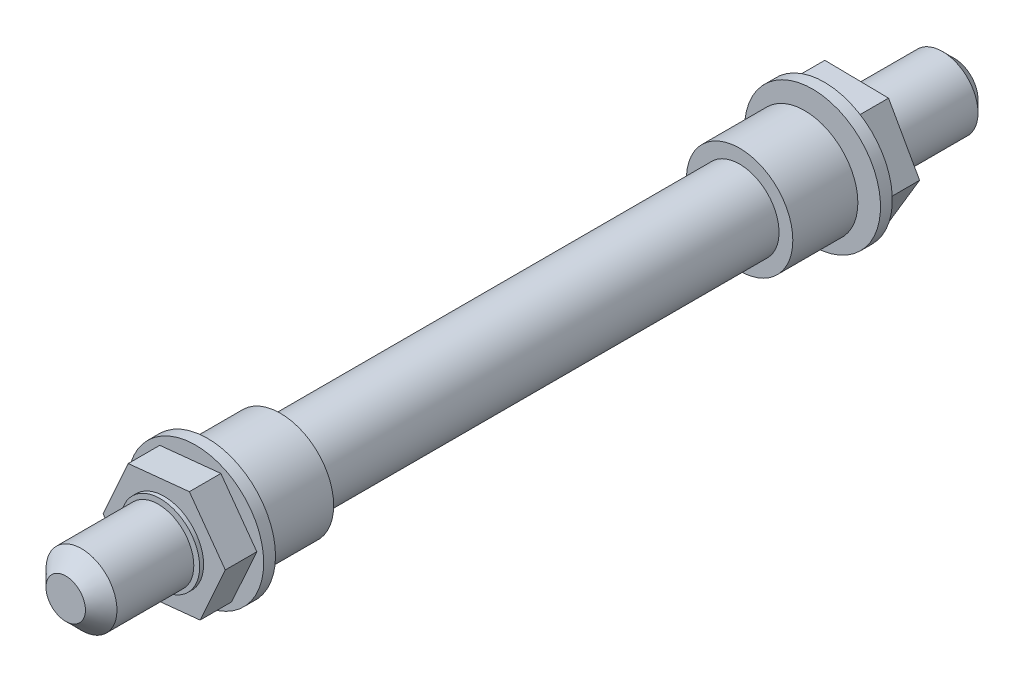
ISO-10303-21;
HEADER;
FILE_DESCRIPTION(('STEP AP214'),'2;1');
FILE_NAME('part.step','',(''),(''),'','','');
FILE_SCHEMA(('AUTOMOTIVE_DESIGN { 1 0 10303 214 1 1 1 1 }'));
ENDSEC;
DATA;
#1=APPLICATION_CONTEXT('core data for automotive mechanical design processes');
#2=APPLICATION_PROTOCOL_DEFINITION('international standard','automotive_design',2000,#1);
#3=PRODUCT_CONTEXT('',#1,'mechanical');
#4=PRODUCT('Part','Part','',(#3));
#5=PRODUCT_RELATED_PRODUCT_CATEGORY('part','',(#4));
#6=PRODUCT_DEFINITION_FORMATION('','',#4);
#7=PRODUCT_DEFINITION_CONTEXT('part definition',#1,'design');
#8=PRODUCT_DEFINITION('design','',#6,#7);
#9=PRODUCT_DEFINITION_SHAPE('','',#8);
#10=(LENGTH_UNIT() NAMED_UNIT(*) SI_UNIT(.MILLI.,.METRE.));
#11=(NAMED_UNIT(*) PLANE_ANGLE_UNIT() SI_UNIT($,.RADIAN.));
#12=(NAMED_UNIT(*) SI_UNIT($,.STERADIAN.) SOLID_ANGLE_UNIT());
#13=UNCERTAINTY_MEASURE_WITH_UNIT(LENGTH_MEASURE(1.E-05),#10,'distance_accuracy_value','');
#14=(GEOMETRIC_REPRESENTATION_CONTEXT(3) GLOBAL_UNCERTAINTY_ASSIGNED_CONTEXT((#13)) GLOBAL_UNIT_ASSIGNED_CONTEXT((#10,
#11,#12)) REPRESENTATION_CONTEXT('',''));
#15=CARTESIAN_POINT('',(0.,0.,0.));
#16=DIRECTION('',(0.,0.,1.));
#17=DIRECTION('',(1.,0.,0.));
#18=AXIS2_PLACEMENT_3D('',#15,#16,#17);
#19=CARTESIAN_POINT('',(0.,0.,-79.75));
#20=DIRECTION('',(0.,0.,-1.));
#21=DIRECTION('',(-1.,0.,0.));
#22=AXIS2_PLACEMENT_3D('',#19,#20,#21);
#23=PLANE('',#22);
#24=CARTESIAN_POINT('',(0.,0.,-79.75));
#25=DIRECTION('',(0.,0.,-1.));
#26=DIRECTION('',(-1.,0.,0.));
#27=AXIS2_PLACEMENT_3D('',#24,#25,#26);
#28=CIRCLE('',#27,17.25);
#29=CARTESIAN_POINT('',(-17.25,0.,-79.75));
#30=VERTEX_POINT('',#29);
#31=EDGE_CURVE('E194',#30,#30,#28,.T.);
#32=ORIENTED_EDGE('',*,*,#31,.T.);
#33=EDGE_LOOP('',(#32));
#34=FACE_BOUND('',#33,.T.);
#35=DIRECTION('',(0.999894472103177,-0.0145273761398714,0.));
#36=VECTOR('',#35,1.);
#37=CARTESIAN_POINT('',(-7.87866753086163,14.1159459927941,-79.75));
#38=LINE('',#37,#36);
#39=CARTESIAN_POINT('',(-7.87866753086163,14.1159459927941,-79.75));
#40=VERTEX_POINT('',#39);
#41=CARTESIAN_POINT('',(8.28543406277803,13.8810992260948,-79.75));
#42=VERTEX_POINT('',#41);
#43=EDGE_CURVE('E326',#40,#42,#38,.T.);
#44=ORIENTED_EDGE('',*,*,#43,.F.);
#45=DIRECTION('',(0.512528312839049,0.858670325875046,0.));
#46=VECTOR('',#45,1.);
#47=CARTESIAN_POINT('',(-16.1641015936397,0.234846766699263,-79.75));
#48=LINE('',#47,#46);
#49=CARTESIAN_POINT('',(-16.1641015936397,0.234846766699263,-79.75));
#50=VERTEX_POINT('',#49);
#51=EDGE_CURVE('E305',#50,#40,#48,.T.);
#52=ORIENTED_EDGE('',*,*,#51,.F.);
#53=DIRECTION('',(-0.487366159264128,0.873197702014918,0.));
#54=VECTOR('',#53,1.);
#55=CARTESIAN_POINT('',(-8.28543406277803,-13.8810992260948,-79.75));
#56=LINE('',#55,#54);
#57=CARTESIAN_POINT('',(-8.28543406277803,-13.8810992260948,-79.75));
#58=VERTEX_POINT('',#57);
#59=EDGE_CURVE('E301',#58,#50,#56,.T.);
#60=ORIENTED_EDGE('',*,*,#59,.F.);
#61=DIRECTION('',(-0.999894472103177,0.0145273761398714,0.));
#62=VECTOR('',#61,1.);
#63=CARTESIAN_POINT('',(7.87866753086163,-14.1159459927941,-79.75));
#64=LINE('',#63,#62);
#65=CARTESIAN_POINT('',(7.87866753086163,-14.1159459927941,-79.75));
#66=VERTEX_POINT('',#65);
#67=EDGE_CURVE('E320',#66,#58,#64,.T.);
#68=ORIENTED_EDGE('',*,*,#67,.F.);
#69=DIRECTION('',(-0.512528312839049,-0.858670325875046,0.));
#70=VECTOR('',#69,1.);
#71=CARTESIAN_POINT('',(16.1641015936397,-0.234846766699264,-79.75));
#72=LINE('',#71,#70);
#73=CARTESIAN_POINT('',(16.1641015936397,-0.234846766699264,-79.75));
#74=VERTEX_POINT('',#73);
#75=EDGE_CURVE('E322',#74,#66,#72,.T.);
#76=ORIENTED_EDGE('',*,*,#75,.F.);
#77=DIRECTION('',(0.487366159264128,-0.873197702014918,0.));
#78=VECTOR('',#77,1.);
#79=CARTESIAN_POINT('',(8.28543406277803,13.8810992260948,-79.75));
#80=LINE('',#79,#78);
#81=EDGE_CURVE('E324',#42,#74,#80,.T.);
#82=ORIENTED_EDGE('',*,*,#81,.F.);
#83=EDGE_LOOP('',(#44,#52,#60,#68,#76,#82));
#84=FACE_BOUND('',#83,.T.);
#85=ADVANCED_FACE('F34',(#34,#84),#23,.T.);
#86=CARTESIAN_POINT('',(0.,0.,-88.75));
#87=DIRECTION('',(0.,0.,1.));
#88=DIRECTION('',(1.,0.,0.));
#89=AXIS2_PLACEMENT_3D('',#86,#87,#88);
#90=CYLINDRICAL_SURFACE('',#89,10.);
#91=CARTESIAN_POINT('',(0.,0.,-74.75));
#92=DIRECTION('',(0.,0.,-1.));
#93=DIRECTION('',(-1.,0.,0.));
#94=AXIS2_PLACEMENT_3D('',#91,#92,#93);
#95=CIRCLE('',#94,10.);
#96=CARTESIAN_POINT('',(-10.,0.,-74.75));
#97=VERTEX_POINT('',#96);
#98=EDGE_CURVE('E179',#97,#97,#95,.T.);
#99=ORIENTED_EDGE('',*,*,#98,.T.);
#100=EDGE_LOOP('',(#99));
#101=FACE_BOUND('',#100,.T.);
#102=CARTESIAN_POINT('',(0.,0.,-76.75));
#103=DIRECTION('',(0.,0.,-1.));
#104=DIRECTION('',(-1.,0.,0.));
#105=AXIS2_PLACEMENT_3D('',#102,#103,#104);
#106=CIRCLE('',#105,10.);
#107=CARTESIAN_POINT('',(-10.,0.,-76.75));
#108=VERTEX_POINT('',#107);
#109=EDGE_CURVE('E191',#108,#108,#106,.F.);
#110=ORIENTED_EDGE('',*,*,#109,.T.);
#111=EDGE_LOOP('',(#110));
#112=FACE_BOUND('',#111,.T.);
#113=ADVANCED_FACE('F349',(#101,#112),#90,.T.);
#114=CARTESIAN_POINT('',(0.,0.,88.75));
#115=DIRECTION('',(0.,0.,1.));
#116=DIRECTION('',(1.,0.,0.));
#117=AXIS2_PLACEMENT_3D('',#114,#115,#116);
#118=PLANE('',#117);
#119=CARTESIAN_POINT('',(0.,0.,88.75));
#120=DIRECTION('',(0.,0.,1.));
#121=DIRECTION('',(1.,0.,0.));
#122=AXIS2_PLACEMENT_3D('',#119,#120,#121);
#123=CIRCLE('',#122,10.);
#124=CARTESIAN_POINT('',(10.,0.,88.75));
#125=VERTEX_POINT('',#124);
#126=EDGE_CURVE('E156',#125,#125,#123,.T.);
#127=ORIENTED_EDGE('',*,*,#126,.T.);
#128=EDGE_LOOP('',(#127));
#129=FACE_BOUND('',#128,.T.);
#130=CARTESIAN_POINT('',(0.,0.,88.75));
#131=DIRECTION('',(0.,0.,1.));
#132=DIRECTION('',(1.,0.,0.));
#133=AXIS2_PLACEMENT_3D('',#130,#131,#132);
#134=CIRCLE('',#133,3.);
#135=CARTESIAN_POINT('',(3.,0.,88.75));
#136=VERTEX_POINT('',#135);
#137=EDGE_CURVE('E149',#136,#136,#134,.T.);
#138=ORIENTED_EDGE('',*,*,#137,.F.);
#139=EDGE_LOOP('',(#138));
#140=FACE_BOUND('',#139,.T.);
#141=ADVANCED_FACE('F354',(#129,#140),#118,.T.);
#142=CARTESIAN_POINT('',(0.,0.,88.75));
#143=DIRECTION('',(0.,0.,-1.));
#144=DIRECTION('',(-1.,0.,0.));
#145=AXIS2_PLACEMENT_3D('',#142,#143,#144);
#146=CYLINDRICAL_SURFACE('',#145,10.);
#147=CARTESIAN_POINT('',(0.,0.,87.75));
#148=DIRECTION('',(0.,0.,1.));
#149=DIRECTION('',(1.,0.,0.));
#150=AXIS2_PLACEMENT_3D('',#147,#148,#149);
#151=CIRCLE('',#150,10.);
#152=CARTESIAN_POINT('',(10.,0.,87.75));
#153=VERTEX_POINT('',#152);
#154=EDGE_CURVE('E145',#153,#153,#151,.T.);
#155=ORIENTED_EDGE('',*,*,#154,.T.);
#156=EDGE_LOOP('',(#155));
#157=FACE_BOUND('',#156,.T.);
#158=ORIENTED_EDGE('',*,*,#126,.F.);
#159=EDGE_LOOP('',(#158));
#160=FACE_BOUND('',#159,.T.);
#161=ADVANCED_FACE('F459',(#157,#160),#146,.T.);
#162=CARTESIAN_POINT('',(0.,0.,89.23));
#163=DIRECTION('',(0.,0.,-1.));
#164=DIRECTION('',(-1.,0.,0.));
#165=AXIS2_PLACEMENT_3D('',#162,#163,#164);
#166=CYLINDRICAL_SURFACE('',#165,3.);
#167=CARTESIAN_POINT('',(0.,0.,89.23));
#168=DIRECTION('',(0.,0.,1.));
#169=DIRECTION('',(1.,0.,0.));
#170=AXIS2_PLACEMENT_3D('',#167,#168,#169);
#171=CIRCLE('',#170,3.);
#172=CARTESIAN_POINT('',(3.,0.,89.23));
#173=VERTEX_POINT('',#172);
#174=EDGE_CURVE('E150',#173,#173,#171,.T.);
#175=ORIENTED_EDGE('',*,*,#174,.F.);
#176=EDGE_LOOP('',(#175));
#177=FACE_BOUND('',#176,.T.);
#178=ORIENTED_EDGE('',*,*,#137,.T.);
#179=EDGE_LOOP('',(#178));
#180=FACE_BOUND('',#179,.T.);
#181=ADVANCED_FACE('F452',(#177,#180),#166,.T.);
#182=CARTESIAN_POINT('',(0.,0.,89.23));
#183=DIRECTION('',(0.,0.,1.));
#184=DIRECTION('',(1.,0.,0.));
#185=AXIS2_PLACEMENT_3D('',#182,#183,#184);
#186=PLANE('',#185);
#187=CARTESIAN_POINT('',(0.,0.,89.23));
#188=DIRECTION('',(0.,0.,1.));
#189=DIRECTION('',(1.,0.,0.));
#190=AXIS2_PLACEMENT_3D('',#187,#188,#189);
#191=CIRCLE('',#190,9.);
#192=CARTESIAN_POINT('',(9.,0.,89.23));
#193=VERTEX_POINT('',#192);
#194=EDGE_CURVE('E146',#193,#193,#191,.T.);
#195=ORIENTED_EDGE('',*,*,#194,.F.);
#196=EDGE_LOOP('',(#195));
#197=FACE_BOUND('',#196,.T.);
#198=ORIENTED_EDGE('',*,*,#174,.T.);
#199=EDGE_LOOP('',(#198));
#200=FACE_BOUND('',#199,.T.);
#201=ADVANCED_FACE('F449',(#197,#200),#186,.F.);
#202=CARTESIAN_POINT('',(0.,0.,112.73));
#203=DIRECTION('',(0.,0.,-1.));
#204=DIRECTION('',(-1.,0.,0.));
#205=AXIS2_PLACEMENT_3D('',#202,#203,#204);
#206=CYLINDRICAL_SURFACE('',#205,9.);
#207=CARTESIAN_POINT('',(0.,0.,108.73));
#208=DIRECTION('',(0.,0.,1.));
#209=DIRECTION('',(1.,0.,0.));
#210=AXIS2_PLACEMENT_3D('',#207,#208,#209);
#211=CIRCLE('',#210,9.);
#212=CARTESIAN_POINT('',(9.,0.,108.73));
#213=VERTEX_POINT('',#212);
#214=EDGE_CURVE('E173',#213,#213,#211,.F.);
#215=ORIENTED_EDGE('',*,*,#214,.T.);
#216=EDGE_LOOP('',(#215));
#217=FACE_BOUND('',#216,.T.);
#218=ORIENTED_EDGE('',*,*,#194,.T.);
#219=EDGE_LOOP('',(#218));
#220=FACE_BOUND('',#219,.T.);
#221=ADVANCED_FACE('F447',(#217,#220),#206,.T.);
#222=CARTESIAN_POINT('',(0.,0.,112.73));
#223=DIRECTION('',(0.,0.,1.));
#224=DIRECTION('',(1.,0.,0.));
#225=AXIS2_PLACEMENT_3D('',#222,#223,#224);
#226=PLANE('',#225);
#227=CARTESIAN_POINT('',(0.,0.,112.73));
#228=DIRECTION('',(0.,0.,1.));
#229=DIRECTION('',(1.,0.,0.));
#230=AXIS2_PLACEMENT_3D('',#227,#228,#229);
#231=CIRCLE('',#230,5.);
#232=CARTESIAN_POINT('',(5.,0.,112.73));
#233=VERTEX_POINT('',#232);
#234=EDGE_CURVE('E170',#233,#233,#231,.T.);
#235=ORIENTED_EDGE('',*,*,#234,.T.);
#236=EDGE_LOOP('',(#235));
#237=FACE_BOUND('',#236,.T.);
#238=ADVANCED_FACE('F444',(#237),#226,.T.);
#239=CARTESIAN_POINT('',(0.,0.,112.73));
#240=DIRECTION('',(0.,0.,-1.));
#241=DIRECTION('',(-1.,0.,0.));
#242=AXIS2_PLACEMENT_3D('',#239,#240,#241);
#243=CONICAL_SURFACE('',#242,5.,0.785398163397446);
#244=ORIENTED_EDGE('',*,*,#214,.F.);
#245=EDGE_LOOP('',(#244));
#246=FACE_BOUND('',#245,.T.);
#247=ORIENTED_EDGE('',*,*,#234,.F.);
#248=EDGE_LOOP('',(#247));
#249=FACE_BOUND('',#248,.T.);
#250=ADVANCED_FACE('F425',(#246,#249),#243,.T.);
#251=CARTESIAN_POINT('',(6.39236923244394,14.217510879057,87.75));
#252=DIRECTION('',(0.,0.,1.));
#253=DIRECTION('',(1.,0.,0.));
#254=AXIS2_PLACEMENT_3D('',#251,#252,#253);
#255=PLANE('',#254);
#256=DIRECTION('',(-0.584826376774778,0.811158498092996,0.));
#257=VECTOR('',#256,1.);
#258=CARTESIAN_POINT('',(15.508910216067,1.57280129386201,87.75));
#259=LINE('',#258,#257);
#260=CARTESIAN_POINT('',(15.508910216067,1.57280129386201,87.75));
#261=VERTEX_POINT('',#260);
#262=CARTESIAN_POINT('',(6.39236923244394,14.217510879057,87.75));
#263=VERTEX_POINT('',#262);
#264=EDGE_CURVE('E135',#261,#263,#259,.T.);
#265=ORIENTED_EDGE('',*,*,#264,.T.);
#266=DIRECTION('',(-0.994897054231555,-0.10089525004367,0.));
#267=VECTOR('',#266,1.);
#268=CARTESIAN_POINT('',(6.39236923244394,14.217510879057,87.75));
#269=LINE('',#268,#267);
#270=CARTESIAN_POINT('',(-9.11654098362302,12.644709585195,87.75));
#271=VERTEX_POINT('',#270);
#272=EDGE_CURVE('E237',#263,#271,#269,.T.);
#273=ORIENTED_EDGE('',*,*,#272,.T.);
#274=DIRECTION('',(-0.410070677456777,-0.912053748136666,0.));
#275=VECTOR('',#274,1.);
#276=CARTESIAN_POINT('',(-9.11654098362302,12.644709585195,87.75));
#277=LINE('',#276,#275);
#278=CARTESIAN_POINT('',(-15.508910216067,-1.57280129386202,87.75));
#279=VERTEX_POINT('',#278);
#280=EDGE_CURVE('E100',#271,#279,#277,.T.);
#281=ORIENTED_EDGE('',*,*,#280,.T.);
#282=DIRECTION('',(0.584826376774778,-0.811158498092996,0.));
#283=VECTOR('',#282,1.);
#284=CARTESIAN_POINT('',(-15.508910216067,-1.57280129386202,87.75));
#285=LINE('',#284,#283);
#286=CARTESIAN_POINT('',(-6.39236923244394,-14.217510879057,87.75));
#287=VERTEX_POINT('',#286);
#288=EDGE_CURVE('E92',#279,#287,#285,.T.);
#289=ORIENTED_EDGE('',*,*,#288,.T.);
#290=DIRECTION('',(0.994897054231555,0.10089525004367,0.));
#291=VECTOR('',#290,1.);
#292=CARTESIAN_POINT('',(-6.39236923244394,-14.217510879057,87.75));
#293=LINE('',#292,#291);
#294=CARTESIAN_POINT('',(9.11654098362302,-12.644709585195,87.75));
#295=VERTEX_POINT('',#294);
#296=EDGE_CURVE('E97',#287,#295,#293,.T.);
#297=ORIENTED_EDGE('',*,*,#296,.T.);
#298=DIRECTION('',(0.410070677456777,0.912053748136666,0.));
#299=VECTOR('',#298,1.);
#300=CARTESIAN_POINT('',(9.11654098362302,-12.644709585195,87.75));
#301=LINE('',#300,#299);
#302=EDGE_CURVE('E58',#295,#261,#301,.T.);
#303=ORIENTED_EDGE('',*,*,#302,.T.);
#304=EDGE_LOOP('',(#265,#273,#281,#289,#297,#303));
#305=FACE_BOUND('',#304,.T.);
#306=ORIENTED_EDGE('',*,*,#154,.F.);
#307=EDGE_LOOP('',(#306));
#308=FACE_BOUND('',#307,.T.);
#309=ADVANCED_FACE('F94',(#305,#308),#255,.T.);
#310=CARTESIAN_POINT('',(15.508910216067,1.57280129386201,87.75));
#311=DIRECTION('',(-0.811158498092996,-0.584826376774778,0.));
#312=DIRECTION('',(0.584826376774778,-0.811158498092996,0.));
#313=AXIS2_PLACEMENT_3D('',#310,#311,#312);
#314=PLANE('',#313);
#315=DIRECTION('',(-0.584826376774778,0.811158498092996,0.));
#316=VECTOR('',#315,1.);
#317=CARTESIAN_POINT('',(15.508910216067,1.57280129386201,79.75));
#318=LINE('',#317,#316);
#319=CARTESIAN_POINT('',(15.508910216067,1.57280129386201,79.75));
#320=VERTEX_POINT('',#319);
#321=CARTESIAN_POINT('',(6.39236923244394,14.217510879057,79.75));
#322=VERTEX_POINT('',#321);
#323=EDGE_CURVE('E71',#320,#322,#318,.T.);
#324=ORIENTED_EDGE('',*,*,#323,.T.);
#325=DIRECTION('',(0.,0.,-1.));
#326=VECTOR('',#325,1.);
#327=CARTESIAN_POINT('',(6.39236923244394,14.217510879057,87.75));
#328=LINE('',#327,#326);
#329=EDGE_CURVE('E143',#263,#322,#328,.T.);
#330=ORIENTED_EDGE('',*,*,#329,.F.);
#331=ORIENTED_EDGE('',*,*,#264,.F.);
#332=DIRECTION('',(0.,0.,-1.));
#333=VECTOR('',#332,1.);
#334=CARTESIAN_POINT('',(15.508910216067,1.57280129386201,87.75));
#335=LINE('',#334,#333);
#336=EDGE_CURVE('E120',#261,#320,#335,.T.);
#337=ORIENTED_EDGE('',*,*,#336,.T.);
#338=EDGE_LOOP('',(#324,#330,#331,#337));
#339=FACE_BOUND('',#338,.T.);
#340=ADVANCED_FACE('F424',(#339),#314,.F.);
#341=CARTESIAN_POINT('',(6.39236923244394,14.217510879057,87.75));
#342=DIRECTION('',(0.10089525004367,-0.994897054231555,0.));
#343=DIRECTION('',(0.994897054231555,0.10089525004367,0.));
#344=AXIS2_PLACEMENT_3D('',#341,#342,#343);
#345=PLANE('',#344);
#346=DIRECTION('',(-0.994897054231555,-0.10089525004367,0.));
#347=VECTOR('',#346,1.);
#348=CARTESIAN_POINT('',(6.39236923244394,14.217510879057,79.75));
#349=LINE('',#348,#347);
#350=CARTESIAN_POINT('',(-9.11654098362302,12.644709585195,79.75));
#351=VERTEX_POINT('',#350);
#352=EDGE_CURVE('E80',#322,#351,#349,.T.);
#353=ORIENTED_EDGE('',*,*,#352,.T.);
#354=DIRECTION('',(0.,0.,-1.));
#355=VECTOR('',#354,1.);
#356=CARTESIAN_POINT('',(-9.11654098362302,12.644709585195,87.75));
#357=LINE('',#356,#355);
#358=EDGE_CURVE('E140',#271,#351,#357,.T.);
#359=ORIENTED_EDGE('',*,*,#358,.F.);
#360=ORIENTED_EDGE('',*,*,#272,.F.);
#361=ORIENTED_EDGE('',*,*,#329,.T.);
#362=EDGE_LOOP('',(#353,#359,#360,#361));
#363=FACE_BOUND('',#362,.T.);
#364=ADVANCED_FACE('F242',(#363),#345,.F.);
#365=CARTESIAN_POINT('',(-9.11654098362302,12.644709585195,87.75));
#366=DIRECTION('',(0.912053748136666,-0.410070677456777,0.));
#367=DIRECTION('',(0.410070677456777,0.912053748136666,0.));
#368=AXIS2_PLACEMENT_3D('',#365,#366,#367);
#369=PLANE('',#368);
#370=DIRECTION('',(-0.410070677456777,-0.912053748136666,0.));
#371=VECTOR('',#370,1.);
#372=CARTESIAN_POINT('',(-9.11654098362302,12.644709585195,79.75));
#373=LINE('',#372,#371);
#374=CARTESIAN_POINT('',(-15.508910216067,-1.57280129386202,79.75));
#375=VERTEX_POINT('',#374);
#376=EDGE_CURVE('E127',#351,#375,#373,.T.);
#377=ORIENTED_EDGE('',*,*,#376,.T.);
#378=DIRECTION('',(0.,0.,-1.));
#379=VECTOR('',#378,1.);
#380=CARTESIAN_POINT('',(-15.508910216067,-1.57280129386202,87.75));
#381=LINE('',#380,#379);
#382=EDGE_CURVE('E114',#279,#375,#381,.T.);
#383=ORIENTED_EDGE('',*,*,#382,.F.);
#384=ORIENTED_EDGE('',*,*,#280,.F.);
#385=ORIENTED_EDGE('',*,*,#358,.T.);
#386=EDGE_LOOP('',(#377,#383,#384,#385));
#387=FACE_BOUND('',#386,.T.);
#388=ADVANCED_FACE('F244',(#387),#369,.F.);
#389=CARTESIAN_POINT('',(-15.508910216067,-1.57280129386202,87.75));
#390=DIRECTION('',(0.811158498092996,0.584826376774778,0.));
#391=DIRECTION('',(-0.584826376774778,0.811158498092996,0.));
#392=AXIS2_PLACEMENT_3D('',#389,#390,#391);
#393=PLANE('',#392);
#394=DIRECTION('',(0.584826376774778,-0.811158498092996,0.));
#395=VECTOR('',#394,1.);
#396=CARTESIAN_POINT('',(-15.508910216067,-1.57280129386202,79.75));
#397=LINE('',#396,#395);
#398=CARTESIAN_POINT('',(-6.39236923244394,-14.217510879057,79.75));
#399=VERTEX_POINT('',#398);
#400=EDGE_CURVE('E111',#375,#399,#397,.T.);
#401=ORIENTED_EDGE('',*,*,#400,.T.);
#402=DIRECTION('',(0.,0.,-1.));
#403=VECTOR('',#402,1.);
#404=CARTESIAN_POINT('',(-6.39236923244394,-14.217510879057,87.75));
#405=LINE('',#404,#403);
#406=EDGE_CURVE('E107',#287,#399,#405,.T.);
#407=ORIENTED_EDGE('',*,*,#406,.F.);
#408=ORIENTED_EDGE('',*,*,#288,.F.);
#409=ORIENTED_EDGE('',*,*,#382,.T.);
#410=EDGE_LOOP('',(#401,#407,#408,#409));
#411=FACE_BOUND('',#410,.T.);
#412=ADVANCED_FACE('F108',(#411),#393,.F.);
#413=CARTESIAN_POINT('',(-6.39236923244394,-14.217510879057,87.75));
#414=DIRECTION('',(-0.10089525004367,0.994897054231555,0.));
#415=DIRECTION('',(-0.994897054231555,-0.10089525004367,0.));
#416=AXIS2_PLACEMENT_3D('',#413,#414,#415);
#417=PLANE('',#416);
#418=DIRECTION('',(0.994897054231555,0.10089525004367,0.));
#419=VECTOR('',#418,1.);
#420=CARTESIAN_POINT('',(-6.39236923244394,-14.217510879057,79.75));
#421=LINE('',#420,#419);
#422=CARTESIAN_POINT('',(9.11654098362302,-12.644709585195,79.75));
#423=VERTEX_POINT('',#422);
#424=EDGE_CURVE('E131',#399,#423,#421,.T.);
#425=ORIENTED_EDGE('',*,*,#424,.T.);
#426=DIRECTION('',(0.,0.,-1.));
#427=VECTOR('',#426,1.);
#428=CARTESIAN_POINT('',(9.11654098362302,-12.644709585195,87.75));
#429=LINE('',#428,#427);
#430=EDGE_CURVE('E115',#295,#423,#429,.T.);
#431=ORIENTED_EDGE('',*,*,#430,.F.);
#432=ORIENTED_EDGE('',*,*,#296,.F.);
#433=ORIENTED_EDGE('',*,*,#406,.T.);
#434=EDGE_LOOP('',(#425,#431,#432,#433));
#435=FACE_BOUND('',#434,.T.);
#436=ADVANCED_FACE('F117',(#435),#417,.F.);
#437=CARTESIAN_POINT('',(9.11654098362302,-12.644709585195,87.75));
#438=DIRECTION('',(-0.912053748136666,0.410070677456777,0.));
#439=DIRECTION('',(-0.410070677456777,-0.912053748136666,0.));
#440=AXIS2_PLACEMENT_3D('',#437,#438,#439);
#441=PLANE('',#440);
#442=DIRECTION('',(0.410070677456777,0.912053748136666,0.));
#443=VECTOR('',#442,1.);
#444=CARTESIAN_POINT('',(9.11654098362302,-12.644709585195,79.75));
#445=LINE('',#444,#443);
#446=EDGE_CURVE('E133',#423,#320,#445,.T.);
#447=ORIENTED_EDGE('',*,*,#446,.T.);
#448=ORIENTED_EDGE('',*,*,#336,.F.);
#449=ORIENTED_EDGE('',*,*,#302,.F.);
#450=ORIENTED_EDGE('',*,*,#430,.T.);
#451=EDGE_LOOP('',(#447,#448,#449,#450));
#452=FACE_BOUND('',#451,.T.);
#453=ADVANCED_FACE('F414',(#452),#441,.F.);
#454=CARTESIAN_POINT('',(0.,0.,79.75));
#455=DIRECTION('',(0.,0.,1.));
#456=DIRECTION('',(1.,0.,0.));
#457=AXIS2_PLACEMENT_3D('',#454,#455,#456);
#458=PLANE('',#457);
#459=CARTESIAN_POINT('',(0.,0.,79.75));
#460=DIRECTION('',(0.,0.,1.));
#461=DIRECTION('',(1.,0.,0.));
#462=AXIS2_PLACEMENT_3D('',#459,#460,#461);
#463=CIRCLE('',#462,17.25);
#464=CARTESIAN_POINT('',(17.25,0.,79.75));
#465=VERTEX_POINT('',#464);
#466=EDGE_CURVE('E125',#465,#465,#463,.T.);
#467=ORIENTED_EDGE('',*,*,#466,.T.);
#468=EDGE_LOOP('',(#467));
#469=FACE_BOUND('',#468,.T.);
#470=ORIENTED_EDGE('',*,*,#323,.F.);
#471=ORIENTED_EDGE('',*,*,#446,.F.);
#472=ORIENTED_EDGE('',*,*,#424,.F.);
#473=ORIENTED_EDGE('',*,*,#400,.F.);
#474=ORIENTED_EDGE('',*,*,#376,.F.);
#475=ORIENTED_EDGE('',*,*,#352,.F.);
#476=EDGE_LOOP('',(#470,#471,#472,#473,#474,#475));
#477=FACE_BOUND('',#476,.T.);
#478=ADVANCED_FACE('F410',(#469,#477),#458,.T.);
#479=CARTESIAN_POINT('',(0.,0.,76.75));
#480=DIRECTION('',(0.,0.,1.));
#481=DIRECTION('',(1.,0.,0.));
#482=AXIS2_PLACEMENT_3D('',#479,#480,#481);
#483=PLANE('',#482);
#484=CARTESIAN_POINT('',(0.,0.,76.75));
#485=DIRECTION('',(0.,0.,1.));
#486=DIRECTION('',(1.,0.,0.));
#487=AXIS2_PLACEMENT_3D('',#484,#485,#486);
#488=CIRCLE('',#487,17.25);
#489=CARTESIAN_POINT('',(17.25,0.,76.75));
#490=VERTEX_POINT('',#489);
#491=EDGE_CURVE('E229',#490,#490,#488,.T.);
#492=ORIENTED_EDGE('',*,*,#491,.F.);
#493=EDGE_LOOP('',(#492));
#494=FACE_BOUND('',#493,.T.);
#495=CARTESIAN_POINT('',(0.,0.,76.75));
#496=DIRECTION('',(0.,0.,1.));
#497=DIRECTION('',(1.,0.,0.));
#498=AXIS2_PLACEMENT_3D('',#495,#496,#497);
#499=CIRCLE('',#498,10.5);
#500=CARTESIAN_POINT('',(10.5,0.,76.75));
#501=VERTEX_POINT('',#500);
#502=EDGE_CURVE('E225',#501,#501,#499,.T.);
#503=ORIENTED_EDGE('',*,*,#502,.T.);
#504=EDGE_LOOP('',(#503));
#505=FACE_BOUND('',#504,.T.);
#506=ADVANCED_FACE('F413',(#494,#505),#483,.F.);
#507=CARTESIAN_POINT('',(0.,0.,79.75));
#508=DIRECTION('',(0.,0.,-1.));
#509=DIRECTION('',(-1.,0.,0.));
#510=AXIS2_PLACEMENT_3D('',#507,#508,#509);
#511=CYLINDRICAL_SURFACE('',#510,17.25);
#512=ORIENTED_EDGE('',*,*,#466,.F.);
#513=EDGE_LOOP('',(#512));
#514=FACE_BOUND('',#513,.T.);
#515=ORIENTED_EDGE('',*,*,#491,.T.);
#516=EDGE_LOOP('',(#515));
#517=FACE_BOUND('',#516,.T.);
#518=ADVANCED_FACE('F408',(#514,#517),#511,.T.);
#519=CARTESIAN_POINT('',(0.,0.,79.75));
#520=DIRECTION('',(0.,0.,-1.));
#521=DIRECTION('',(-1.,0.,0.));
#522=AXIS2_PLACEMENT_3D('',#519,#520,#521);
#523=CYLINDRICAL_SURFACE('',#522,10.5);
#524=CARTESIAN_POINT('',(0.,0.,79.75));
#525=DIRECTION('',(0.,0.,1.));
#526=DIRECTION('',(1.,0.,0.));
#527=AXIS2_PLACEMENT_3D('',#524,#525,#526);
#528=CIRCLE('',#527,10.5);
#529=CARTESIAN_POINT('',(10.5,0.,79.75));
#530=VERTEX_POINT('',#529);
#531=EDGE_CURVE('E226',#530,#530,#528,.T.);
#532=ORIENTED_EDGE('',*,*,#531,.T.);
#533=EDGE_LOOP('',(#532));
#534=FACE_BOUND('',#533,.T.);
#535=ORIENTED_EDGE('',*,*,#502,.F.);
#536=EDGE_LOOP('',(#535));
#537=FACE_BOUND('',#536,.T.);
#538=ADVANCED_FACE('F404',(#534,#537),#523,.F.);
#539=CARTESIAN_POINT('',(0.,0.,58.25));
#540=DIRECTION('',(0.,0.,-1.));
#541=DIRECTION('',(-1.,0.,0.));
#542=AXIS2_PLACEMENT_3D('',#539,#540,#541);
#543=CYLINDRICAL_SURFACE('',#542,10.);
#544=CARTESIAN_POINT('',(0.,0.,58.25));
#545=DIRECTION('',(0.,0.,1.));
#546=DIRECTION('',(1.,0.,0.));
#547=AXIS2_PLACEMENT_3D('',#544,#545,#546);
#548=CIRCLE('',#547,10.);
#549=CARTESIAN_POINT('',(10.,0.,58.25));
#550=VERTEX_POINT('',#549);
#551=EDGE_CURVE('E165',#550,#550,#548,.T.);
#552=ORIENTED_EDGE('',*,*,#551,.F.);
#553=EDGE_LOOP('',(#552));
#554=FACE_BOUND('',#553,.T.);
#555=CARTESIAN_POINT('',(0.,0.,-58.25));
#556=DIRECTION('',(0.,0.,-1.));
#557=DIRECTION('',(-1.,0.,0.));
#558=AXIS2_PLACEMENT_3D('',#555,#556,#557);
#559=CIRCLE('',#558,10.);
#560=CARTESIAN_POINT('',(-10.,0.,-58.25));
#561=VERTEX_POINT('',#560);
#562=EDGE_CURVE('E220',#561,#561,#559,.T.);
#563=ORIENTED_EDGE('',*,*,#562,.F.);
#564=EDGE_LOOP('',(#563));
#565=FACE_BOUND('',#564,.T.);
#566=ADVANCED_FACE('F407',(#554,#565),#543,.T.);
#567=CARTESIAN_POINT('',(0.,0.,58.25));
#568=DIRECTION('',(0.,0.,1.));
#569=DIRECTION('',(1.,0.,0.));
#570=AXIS2_PLACEMENT_3D('',#567,#568,#569);
#571=PLANE('',#570);
#572=CARTESIAN_POINT('',(0.,0.,58.25));
#573=DIRECTION('',(0.,0.,1.));
#574=DIRECTION('',(1.,0.,0.));
#575=AXIS2_PLACEMENT_3D('',#572,#573,#574);
#576=CIRCLE('',#575,13.5);
#577=CARTESIAN_POINT('',(13.5,0.,58.25));
#578=VERTEX_POINT('',#577);
#579=EDGE_CURVE('E159',#578,#578,#576,.T.);
#580=ORIENTED_EDGE('',*,*,#579,.F.);
#581=EDGE_LOOP('',(#580));
#582=FACE_BOUND('',#581,.T.);
#583=ORIENTED_EDGE('',*,*,#551,.T.);
#584=EDGE_LOOP('',(#583));
#585=FACE_BOUND('',#584,.T.);
#586=ADVANCED_FACE('F472',(#582,#585),#571,.F.);
#587=CARTESIAN_POINT('',(0.,0.,74.75));
#588=DIRECTION('',(0.,0.,-1.));
#589=DIRECTION('',(-1.,0.,0.));
#590=AXIS2_PLACEMENT_3D('',#587,#588,#589);
#591=CYLINDRICAL_SURFACE('',#590,13.5);
#592=CARTESIAN_POINT('',(0.,0.,74.75));
#593=DIRECTION('',(0.,0.,1.));
#594=DIRECTION('',(1.,0.,0.));
#595=AXIS2_PLACEMENT_3D('',#592,#593,#594);
#596=CIRCLE('',#595,13.5);
#597=CARTESIAN_POINT('',(13.5,0.,74.75));
#598=VERTEX_POINT('',#597);
#599=EDGE_CURVE('E162',#598,#598,#596,.T.);
#600=ORIENTED_EDGE('',*,*,#599,.F.);
#601=EDGE_LOOP('',(#600));
#602=FACE_BOUND('',#601,.T.);
#603=ORIENTED_EDGE('',*,*,#579,.T.);
#604=EDGE_LOOP('',(#603));
#605=FACE_BOUND('',#604,.T.);
#606=ADVANCED_FACE('F470',(#602,#605),#591,.T.);
#607=CARTESIAN_POINT('',(0.,0.,74.75));
#608=DIRECTION('',(0.,0.,1.));
#609=DIRECTION('',(1.,0.,0.));
#610=AXIS2_PLACEMENT_3D('',#607,#608,#609);
#611=PLANE('',#610);
#612=ORIENTED_EDGE('',*,*,#599,.T.);
#613=EDGE_LOOP('',(#612));
#614=FACE_BOUND('',#613,.T.);
#615=CARTESIAN_POINT('',(0.,0.,74.75));
#616=DIRECTION('',(0.,0.,1.));
#617=DIRECTION('',(1.,0.,0.));
#618=AXIS2_PLACEMENT_3D('',#615,#616,#617);
#619=CIRCLE('',#618,10.);
#620=CARTESIAN_POINT('',(10.,0.,74.75));
#621=VERTEX_POINT('',#620);
#622=EDGE_CURVE('E153',#621,#621,#619,.T.);
#623=ORIENTED_EDGE('',*,*,#622,.F.);
#624=EDGE_LOOP('',(#623));
#625=FACE_BOUND('',#624,.T.);
#626=ADVANCED_FACE('F467',(#614,#625),#611,.T.);
#627=ORIENTED_EDGE('',*,*,#622,.T.);
#628=EDGE_LOOP('',(#627));
#629=FACE_BOUND('',#628,.T.);
#630=CARTESIAN_POINT('',(0.,0.,79.75));
#631=DIRECTION('',(0.,0.,1.));
#632=DIRECTION('',(1.,0.,0.));
#633=AXIS2_PLACEMENT_3D('',#630,#631,#632);
#634=CIRCLE('',#633,10.);
#635=CARTESIAN_POINT('',(10.,0.,79.75));
#636=VERTEX_POINT('',#635);
#637=EDGE_CURVE('E176',#636,#636,#634,.T.);
#638=ORIENTED_EDGE('',*,*,#637,.F.);
#639=EDGE_LOOP('',(#638));
#640=FACE_BOUND('',#639,.T.);
#641=ADVANCED_FACE('F428',(#629,#640),#146,.T.);
#642=CARTESIAN_POINT('',(6.39236923244394,14.217510879057,79.75));
#643=DIRECTION('',(0.,0.,1.));
#644=DIRECTION('',(1.,0.,0.));
#645=AXIS2_PLACEMENT_3D('',#642,#643,#644);
#646=PLANE('',#645);
#647=ORIENTED_EDGE('',*,*,#531,.F.);
#648=EDGE_LOOP('',(#647));
#649=FACE_BOUND('',#648,.T.);
#650=ORIENTED_EDGE('',*,*,#637,.T.);
#651=EDGE_LOOP('',(#650));
#652=FACE_BOUND('',#651,.T.);
#653=ADVANCED_FACE('F399',(#649,#652),#646,.F.);
#654=CARTESIAN_POINT('',(0.,0.,-58.25));
#655=DIRECTION('',(0.,0.,-1.));
#656=DIRECTION('',(1.,0.,0.));
#657=AXIS2_PLACEMENT_3D('',#654,#655,#656);
#658=PLANE('',#657);
#659=CARTESIAN_POINT('',(0.,0.,-58.25));
#660=DIRECTION('',(0.,0.,1.));
#661=DIRECTION('',(1.,0.,0.));
#662=AXIS2_PLACEMENT_3D('',#659,#660,#661);
#663=CIRCLE('',#662,13.5);
#664=CARTESIAN_POINT('',(13.5,0.,-58.25));
#665=VERTEX_POINT('',#664);
#666=EDGE_CURVE('E216',#665,#665,#663,.T.);
#667=ORIENTED_EDGE('',*,*,#666,.T.);
#668=EDGE_LOOP('',(#667));
#669=FACE_BOUND('',#668,.T.);
#670=ORIENTED_EDGE('',*,*,#562,.T.);
#671=EDGE_LOOP('',(#670));
#672=FACE_BOUND('',#671,.T.);
#673=ADVANCED_FACE('F396',(#669,#672),#658,.F.);
#674=CARTESIAN_POINT('',(0.,0.,-74.75));
#675=DIRECTION('',(0.,0.,1.));
#676=DIRECTION('',(1.,0.,0.));
#677=AXIS2_PLACEMENT_3D('',#674,#675,#676);
#678=CYLINDRICAL_SURFACE('',#677,13.5);
#679=CARTESIAN_POINT('',(0.,0.,-74.75));
#680=DIRECTION('',(0.,0.,1.));
#681=DIRECTION('',(1.,0.,0.));
#682=AXIS2_PLACEMENT_3D('',#679,#680,#681);
#683=CIRCLE('',#682,13.5);
#684=CARTESIAN_POINT('',(13.5,0.,-74.75));
#685=VERTEX_POINT('',#684);
#686=EDGE_CURVE('E217',#685,#685,#683,.T.);
#687=ORIENTED_EDGE('',*,*,#686,.T.);
#688=EDGE_LOOP('',(#687));
#689=FACE_BOUND('',#688,.T.);
#690=ORIENTED_EDGE('',*,*,#666,.F.);
#691=EDGE_LOOP('',(#690));
#692=FACE_BOUND('',#691,.T.);
#693=ADVANCED_FACE('F394',(#689,#692),#678,.T.);
#694=CARTESIAN_POINT('',(0.,0.,-74.75));
#695=DIRECTION('',(0.,0.,-1.));
#696=DIRECTION('',(1.,0.,0.));
#697=AXIS2_PLACEMENT_3D('',#694,#695,#696);
#698=PLANE('',#697);
#699=ORIENTED_EDGE('',*,*,#98,.F.);
#700=EDGE_LOOP('',(#699));
#701=FACE_BOUND('',#700,.T.);
#702=ORIENTED_EDGE('',*,*,#686,.F.);
#703=EDGE_LOOP('',(#702));
#704=FACE_BOUND('',#703,.T.);
#705=ADVANCED_FACE('F368',(#701,#704),#698,.T.);
#706=CARTESIAN_POINT('',(0.,0.,-79.75));
#707=DIRECTION('',(0.,0.,1.));
#708=DIRECTION('',(1.,0.,0.));
#709=AXIS2_PLACEMENT_3D('',#706,#707,#708);
#710=CYLINDRICAL_SURFACE('',#709,17.25);
#711=ORIENTED_EDGE('',*,*,#31,.F.);
#712=EDGE_LOOP('',(#711));
#713=FACE_BOUND('',#712,.T.);
#714=CARTESIAN_POINT('',(0.,0.,-76.75));
#715=DIRECTION('',(0.,0.,-1.));
#716=DIRECTION('',(-1.,0.,0.));
#717=AXIS2_PLACEMENT_3D('',#714,#715,#716);
#718=CIRCLE('',#717,17.25);
#719=CARTESIAN_POINT('',(-17.25,0.,-76.75));
#720=VERTEX_POINT('',#719);
#721=EDGE_CURVE('E201',#720,#720,#718,.T.);
#722=ORIENTED_EDGE('',*,*,#721,.T.);
#723=EDGE_LOOP('',(#722));
#724=FACE_BOUND('',#723,.T.);
#725=ADVANCED_FACE('F364',(#713,#724),#710,.T.);
#726=CARTESIAN_POINT('',(0.,0.,-76.75));
#727=DIRECTION('',(0.,0.,-1.));
#728=DIRECTION('',(-1.,0.,0.));
#729=AXIS2_PLACEMENT_3D('',#726,#727,#728);
#730=PLANE('',#729);
#731=ORIENTED_EDGE('',*,*,#109,.F.);
#732=EDGE_LOOP('',(#731));
#733=FACE_BOUND('',#732,.T.);
#734=ORIENTED_EDGE('',*,*,#721,.F.);
#735=EDGE_LOOP('',(#734));
#736=FACE_BOUND('',#735,.T.);
#737=ADVANCED_FACE('F361',(#733,#736),#730,.F.);
#738=CARTESIAN_POINT('',(-16.1641015936397,0.234846766699263,-87.75));
#739=DIRECTION('',(0.858670325875046,-0.512528312839049,0.));
#740=DIRECTION('',(0.512528312839049,0.858670325875046,0.));
#741=AXIS2_PLACEMENT_3D('',#738,#739,#740);
#742=PLANE('',#741);
#743=ORIENTED_EDGE('',*,*,#51,.T.);
#744=DIRECTION('',(0.,0.,1.));
#745=VECTOR('',#744,1.);
#746=CARTESIAN_POINT('',(-7.87866753086163,14.1159459927941,-87.75));
#747=LINE('',#746,#745);
#748=CARTESIAN_POINT('',(-7.87866753086163,14.1159459927941,-87.75));
#749=VERTEX_POINT('',#748);
#750=EDGE_CURVE('E206',#749,#40,#747,.T.);
#751=ORIENTED_EDGE('',*,*,#750,.F.);
#752=DIRECTION('',(0.512528312839049,0.858670325875046,0.));
#753=VECTOR('',#752,1.);
#754=CARTESIAN_POINT('',(-16.1641015936397,0.234846766699263,-87.75));
#755=LINE('',#754,#753);
#756=CARTESIAN_POINT('',(-16.1641015936397,0.234846766699263,-87.75));
#757=VERTEX_POINT('',#756);
#758=EDGE_CURVE('E293',#757,#749,#755,.T.);
#759=ORIENTED_EDGE('',*,*,#758,.F.);
#760=DIRECTION('',(0.,0.,1.));
#761=VECTOR('',#760,1.);
#762=CARTESIAN_POINT('',(-16.1641015936397,0.234846766699263,-87.75));
#763=LINE('',#762,#761);
#764=EDGE_CURVE('E317',#757,#50,#763,.T.);
#765=ORIENTED_EDGE('',*,*,#764,.T.);
#766=EDGE_LOOP('',(#743,#751,#759,#765));
#767=FACE_BOUND('',#766,.T.);
#768=ADVANCED_FACE('F303',(#767),#742,.F.);
#769=CARTESIAN_POINT('',(-7.87866753086163,14.1159459927941,-87.75));
#770=DIRECTION('',(-0.0145273761398714,-0.999894472103177,0.));
#771=DIRECTION('',(0.999894472103177,-0.0145273761398714,0.));
#772=AXIS2_PLACEMENT_3D('',#769,#770,#771);
#773=PLANE('',#772);
#774=ORIENTED_EDGE('',*,*,#43,.T.);
#775=DIRECTION('',(0.,0.,1.));
#776=VECTOR('',#775,1.);
#777=CARTESIAN_POINT('',(8.28543406277803,13.8810992260948,-87.75));
#778=LINE('',#777,#776);
#779=CARTESIAN_POINT('',(8.28543406277803,13.8810992260948,-87.75));
#780=VERTEX_POINT('',#779);
#781=EDGE_CURVE('E289',#780,#42,#778,.T.);
#782=ORIENTED_EDGE('',*,*,#781,.F.);
#783=DIRECTION('',(0.999894472103177,-0.0145273761398714,0.));
#784=VECTOR('',#783,1.);
#785=CARTESIAN_POINT('',(-7.87866753086163,14.1159459927941,-87.75));
#786=LINE('',#785,#784);
#787=EDGE_CURVE('E283',#749,#780,#786,.T.);
#788=ORIENTED_EDGE('',*,*,#787,.F.);
#789=ORIENTED_EDGE('',*,*,#750,.T.);
#790=EDGE_LOOP('',(#774,#782,#788,#789));
#791=FACE_BOUND('',#790,.T.);
#792=ADVANCED_FACE('F285',(#791),#773,.F.);
#793=CARTESIAN_POINT('',(8.28543406277803,13.8810992260948,-87.75));
#794=DIRECTION('',(-0.873197702014918,-0.487366159264128,0.));
#795=DIRECTION('',(0.487366159264128,-0.873197702014918,0.));
#796=AXIS2_PLACEMENT_3D('',#793,#794,#795);
#797=PLANE('',#796);
#798=ORIENTED_EDGE('',*,*,#81,.T.);
#799=DIRECTION('',(0.,0.,1.));
#800=VECTOR('',#799,1.);
#801=CARTESIAN_POINT('',(16.1641015936397,-0.234846766699264,-87.75));
#802=LINE('',#801,#800);
#803=CARTESIAN_POINT('',(16.1641015936397,-0.234846766699264,-87.75));
#804=VERTEX_POINT('',#803);
#805=EDGE_CURVE('E307',#804,#74,#802,.T.);
#806=ORIENTED_EDGE('',*,*,#805,.F.);
#807=DIRECTION('',(0.487366159264128,-0.873197702014918,0.));
#808=VECTOR('',#807,1.);
#809=CARTESIAN_POINT('',(8.28543406277803,13.8810992260948,-87.75));
#810=LINE('',#809,#808);
#811=EDGE_CURVE('E292',#780,#804,#810,.T.);
#812=ORIENTED_EDGE('',*,*,#811,.F.);
#813=ORIENTED_EDGE('',*,*,#781,.T.);
#814=EDGE_LOOP('',(#798,#806,#812,#813));
#815=FACE_BOUND('',#814,.T.);
#816=ADVANCED_FACE('F337',(#815),#797,.F.);
#817=CARTESIAN_POINT('',(16.1641015936397,-0.234846766699264,-87.75));
#818=DIRECTION('',(-0.858670325875046,0.512528312839049,0.));
#819=DIRECTION('',(-0.512528312839049,-0.858670325875046,0.));
#820=AXIS2_PLACEMENT_3D('',#817,#818,#819);
#821=PLANE('',#820);
#822=ORIENTED_EDGE('',*,*,#75,.T.);
#823=DIRECTION('',(0.,0.,1.));
#824=VECTOR('',#823,1.);
#825=CARTESIAN_POINT('',(7.87866753086163,-14.1159459927941,-87.75));
#826=LINE('',#825,#824);
#827=CARTESIAN_POINT('',(7.87866753086163,-14.1159459927941,-87.75));
#828=VERTEX_POINT('',#827);
#829=EDGE_CURVE('E311',#828,#66,#826,.T.);
#830=ORIENTED_EDGE('',*,*,#829,.F.);
#831=DIRECTION('',(-0.512528312839049,-0.858670325875046,0.));
#832=VECTOR('',#831,1.);
#833=CARTESIAN_POINT('',(16.1641015936397,-0.234846766699264,-87.75));
#834=LINE('',#833,#832);
#835=EDGE_CURVE('E332',#804,#828,#834,.T.);
#836=ORIENTED_EDGE('',*,*,#835,.F.);
#837=ORIENTED_EDGE('',*,*,#805,.T.);
#838=EDGE_LOOP('',(#822,#830,#836,#837));
#839=FACE_BOUND('',#838,.T.);
#840=ADVANCED_FACE('F340',(#839),#821,.F.);
#841=CARTESIAN_POINT('',(7.87866753086163,-14.1159459927941,-87.75));
#842=DIRECTION('',(0.0145273761398714,0.999894472103177,0.));
#843=DIRECTION('',(-0.999894472103177,0.0145273761398714,0.));
#844=AXIS2_PLACEMENT_3D('',#841,#842,#843);
#845=PLANE('',#844);
#846=ORIENTED_EDGE('',*,*,#67,.T.);
#847=DIRECTION('',(0.,0.,1.));
#848=VECTOR('',#847,1.);
#849=CARTESIAN_POINT('',(-8.28543406277803,-13.8810992260948,-87.75));
#850=LINE('',#849,#848);
#851=CARTESIAN_POINT('',(-8.28543406277803,-13.8810992260948,-87.75));
#852=VERTEX_POINT('',#851);
#853=EDGE_CURVE('E49',#852,#58,#850,.T.);
#854=ORIENTED_EDGE('',*,*,#853,.F.);
#855=DIRECTION('',(-0.999894472103177,0.0145273761398714,0.));
#856=VECTOR('',#855,1.);
#857=CARTESIAN_POINT('',(7.87866753086163,-14.1159459927941,-87.75));
#858=LINE('',#857,#856);
#859=EDGE_CURVE('E330',#828,#852,#858,.T.);
#860=ORIENTED_EDGE('',*,*,#859,.F.);
#861=ORIENTED_EDGE('',*,*,#829,.T.);
#862=EDGE_LOOP('',(#846,#854,#860,#861));
#863=FACE_BOUND('',#862,.T.);
#864=ADVANCED_FACE('F344',(#863),#845,.F.);
#865=CARTESIAN_POINT('',(-8.28543406277803,-13.8810992260948,-87.75));
#866=DIRECTION('',(0.873197702014918,0.487366159264128,0.));
#867=DIRECTION('',(-0.487366159264128,0.873197702014918,0.));
#868=AXIS2_PLACEMENT_3D('',#865,#866,#867);
#869=PLANE('',#868);
#870=ORIENTED_EDGE('',*,*,#59,.T.);
#871=ORIENTED_EDGE('',*,*,#764,.F.);
#872=DIRECTION('',(-0.487366159264128,0.873197702014918,0.));
#873=VECTOR('',#872,1.);
#874=CARTESIAN_POINT('',(-8.28543406277803,-13.8810992260948,-87.75));
#875=LINE('',#874,#873);
#876=EDGE_CURVE('E297',#852,#757,#875,.T.);
#877=ORIENTED_EDGE('',*,*,#876,.F.);
#878=ORIENTED_EDGE('',*,*,#853,.T.);
#879=EDGE_LOOP('',(#870,#871,#877,#878));
#880=FACE_BOUND('',#879,.T.);
#881=ADVANCED_FACE('F346',(#880),#869,.F.);
#882=CARTESIAN_POINT('',(-7.87866753086163,14.1159459927941,-87.75));
#883=DIRECTION('',(0.,0.,-1.));
#884=DIRECTION('',(-1.,0.,0.));
#885=AXIS2_PLACEMENT_3D('',#882,#883,#884);
#886=PLANE('',#885);
#887=CARTESIAN_POINT('',(0.,0.,-87.75));
#888=DIRECTION('',(0.,0.,-1.));
#889=DIRECTION('',(-1.,0.,0.));
#890=AXIS2_PLACEMENT_3D('',#887,#888,#889);
#891=CIRCLE('',#890,10.);
#892=CARTESIAN_POINT('',(-10.,0.,-87.75));
#893=VERTEX_POINT('',#892);
#894=EDGE_CURVE('E11',#893,#893,#891,.F.);
#895=ORIENTED_EDGE('',*,*,#894,.T.);
#896=EDGE_LOOP('',(#895));
#897=FACE_BOUND('',#896,.T.);
#898=ORIENTED_EDGE('',*,*,#758,.T.);
#899=ORIENTED_EDGE('',*,*,#787,.T.);
#900=ORIENTED_EDGE('',*,*,#811,.T.);
#901=ORIENTED_EDGE('',*,*,#835,.T.);
#902=ORIENTED_EDGE('',*,*,#859,.T.);
#903=ORIENTED_EDGE('',*,*,#876,.T.);
#904=EDGE_LOOP('',(#898,#899,#900,#901,#902,#903));
#905=FACE_BOUND('',#904,.T.);
#906=ADVANCED_FACE('F296',(#897,#905),#886,.T.);
#907=CARTESIAN_POINT('',(0.,0.,-112.73));
#908=DIRECTION('',(0.,0.,-1.));
#909=DIRECTION('',(1.,0.,0.));
#910=AXIS2_PLACEMENT_3D('',#907,#908,#909);
#911=PLANE('',#910);
#912=CARTESIAN_POINT('',(0.,0.,-112.73));
#913=DIRECTION('',(0.,0.,-1.));
#914=DIRECTION('',(-1.,0.,0.));
#915=AXIS2_PLACEMENT_3D('',#912,#913,#914);
#916=CIRCLE('',#915,5.99999999999998);
#917=CARTESIAN_POINT('',(-5.99999999999998,0.,-112.73));
#918=VERTEX_POINT('',#917);
#919=EDGE_CURVE('E42',#918,#918,#916,.T.);
#920=ORIENTED_EDGE('',*,*,#919,.T.);
#921=EDGE_LOOP('',(#920));
#922=FACE_BOUND('',#921,.T.);
#923=ADVANCED_FACE('F370',(#922),#911,.T.);
#924=CARTESIAN_POINT('',(0.,0.,-109.73));
#925=DIRECTION('',(0.,0.,1.));
#926=DIRECTION('',(1.,0.,0.));
#927=AXIS2_PLACEMENT_3D('',#924,#925,#926);
#928=CONICAL_SURFACE('',#927,9.,0.785398163397451);
#929=ORIENTED_EDGE('',*,*,#919,.F.);
#930=EDGE_LOOP('',(#929));
#931=FACE_BOUND('',#930,.T.);
#932=CARTESIAN_POINT('',(0.,0.,-109.73));
#933=DIRECTION('',(0.,0.,-1.));
#934=DIRECTION('',(-1.,0.,0.));
#935=AXIS2_PLACEMENT_3D('',#932,#933,#934);
#936=CIRCLE('',#935,9.);
#937=CARTESIAN_POINT('',(-9.,0.,-109.73));
#938=VERTEX_POINT('',#937);
#939=EDGE_CURVE('E187',#938,#938,#936,.F.);
#940=ORIENTED_EDGE('',*,*,#939,.F.);
#941=EDGE_LOOP('',(#940));
#942=FACE_BOUND('',#941,.T.);
#943=ADVANCED_FACE('F36',(#931,#942),#928,.T.);
#944=CARTESIAN_POINT('',(0.,0.,-112.73));
#945=DIRECTION('',(0.,0.,1.));
#946=DIRECTION('',(1.,0.,0.));
#947=AXIS2_PLACEMENT_3D('',#944,#945,#946);
#948=CYLINDRICAL_SURFACE('',#947,9.);
#949=ORIENTED_EDGE('',*,*,#939,.T.);
#950=EDGE_LOOP('',(#949));
#951=FACE_BOUND('',#950,.T.);
#952=CARTESIAN_POINT('',(0.,0.,-89.23));
#953=DIRECTION('',(0.,0.,1.));
#954=DIRECTION('',(1.,0.,0.));
#955=AXIS2_PLACEMENT_3D('',#952,#953,#954);
#956=CIRCLE('',#955,9.);
#957=CARTESIAN_POINT('',(9.,0.,-89.23));
#958=VERTEX_POINT('',#957);
#959=EDGE_CURVE('E193',#958,#958,#956,.T.);
#960=ORIENTED_EDGE('',*,*,#959,.F.);
#961=EDGE_LOOP('',(#960));
#962=FACE_BOUND('',#961,.T.);
#963=ADVANCED_FACE('F378',(#951,#962),#948,.T.);
#964=CARTESIAN_POINT('',(0.,0.,-89.23));
#965=DIRECTION('',(0.,0.,-1.));
#966=DIRECTION('',(1.,0.,0.));
#967=AXIS2_PLACEMENT_3D('',#964,#965,#966);
#968=PLANE('',#967);
#969=CARTESIAN_POINT('',(0.,0.,-89.23));
#970=DIRECTION('',(0.,0.,-1.));
#971=DIRECTION('',(-1.,0.,0.));
#972=AXIS2_PLACEMENT_3D('',#969,#970,#971);
#973=CIRCLE('',#972,3.);
#974=CARTESIAN_POINT('',(-3.,0.,-89.23));
#975=VERTEX_POINT('',#974);
#976=EDGE_CURVE('E198',#975,#975,#973,.F.);
#977=ORIENTED_EDGE('',*,*,#976,.F.);
#978=EDGE_LOOP('',(#977));
#979=FACE_BOUND('',#978,.T.);
#980=ORIENTED_EDGE('',*,*,#959,.T.);
#981=EDGE_LOOP('',(#980));
#982=FACE_BOUND('',#981,.T.);
#983=ADVANCED_FACE('F374',(#979,#982),#968,.F.);
#984=CARTESIAN_POINT('',(0.,0.,-89.23));
#985=DIRECTION('',(0.,0.,1.));
#986=DIRECTION('',(1.,0.,0.));
#987=AXIS2_PLACEMENT_3D('',#984,#985,#986);
#988=CYLINDRICAL_SURFACE('',#987,3.);
#989=ORIENTED_EDGE('',*,*,#976,.T.);
#990=EDGE_LOOP('',(#989));
#991=FACE_BOUND('',#990,.T.);
#992=CARTESIAN_POINT('',(0.,0.,-88.75));
#993=DIRECTION('',(0.,0.,-1.));
#994=DIRECTION('',(-1.,0.,0.));
#995=AXIS2_PLACEMENT_3D('',#992,#993,#994);
#996=CIRCLE('',#995,3.);
#997=CARTESIAN_POINT('',(-3.,0.,-88.75));
#998=VERTEX_POINT('',#997);
#999=EDGE_CURVE('E184',#998,#998,#996,.T.);
#1000=ORIENTED_EDGE('',*,*,#999,.T.);
#1001=EDGE_LOOP('',(#1000));
#1002=FACE_BOUND('',#1001,.T.);
#1003=ADVANCED_FACE('F377',(#991,#1002),#988,.T.);
#1004=CARTESIAN_POINT('',(0.,0.,-88.75));
#1005=DIRECTION('',(0.,0.,-1.));
#1006=DIRECTION('',(1.,0.,0.));
#1007=AXIS2_PLACEMENT_3D('',#1004,#1005,#1006);
#1008=PLANE('',#1007);
#1009=ORIENTED_EDGE('',*,*,#999,.F.);
#1010=EDGE_LOOP('',(#1009));
#1011=FACE_BOUND('',#1010,.T.);
#1012=CARTESIAN_POINT('',(0.,0.,-88.75));
#1013=DIRECTION('',(0.,0.,1.));
#1014=DIRECTION('',(1.,0.,0.));
#1015=AXIS2_PLACEMENT_3D('',#1012,#1013,#1014);
#1016=CIRCLE('',#1015,10.);
#1017=CARTESIAN_POINT('',(10.,0.,-88.75));
#1018=VERTEX_POINT('',#1017);
#1019=EDGE_CURVE('E213',#1018,#1018,#1016,.T.);
#1020=ORIENTED_EDGE('',*,*,#1019,.F.);
#1021=EDGE_LOOP('',(#1020));
#1022=FACE_BOUND('',#1021,.T.);
#1023=ADVANCED_FACE('F385',(#1011,#1022),#1008,.T.);
#1024=ORIENTED_EDGE('',*,*,#894,.F.);
#1025=EDGE_LOOP('',(#1024));
#1026=FACE_BOUND('',#1025,.T.);
#1027=ORIENTED_EDGE('',*,*,#1019,.T.);
#1028=EDGE_LOOP('',(#1027));
#1029=FACE_BOUND('',#1028,.T.);
#1030=ADVANCED_FACE('F357',(#1026,#1029),#90,.T.);
#1031=CLOSED_SHELL('',(#85,#113,#141,#161,#181,#201,#221,#238,#250,#309,#340,#364,#388,#412,
#436,#453,#478,#506,#518,#538,#566,#586,#606,#626,#641,#653,#673,#693,#705,#725,#737,#768,#792,
#816,#840,#864,#881,#906,#923,#943,#963,#983,#1003,#1023,#1030));
#1032=MANIFOLD_SOLID_BREP('B2',#1031);
#1033=ADVANCED_BREP_SHAPE_REPRESENTATION('',(#18,#1032),#14);
#1034=SHAPE_DEFINITION_REPRESENTATION(#9,#1033);
ENDSEC;
END-ISO-10303-21;
